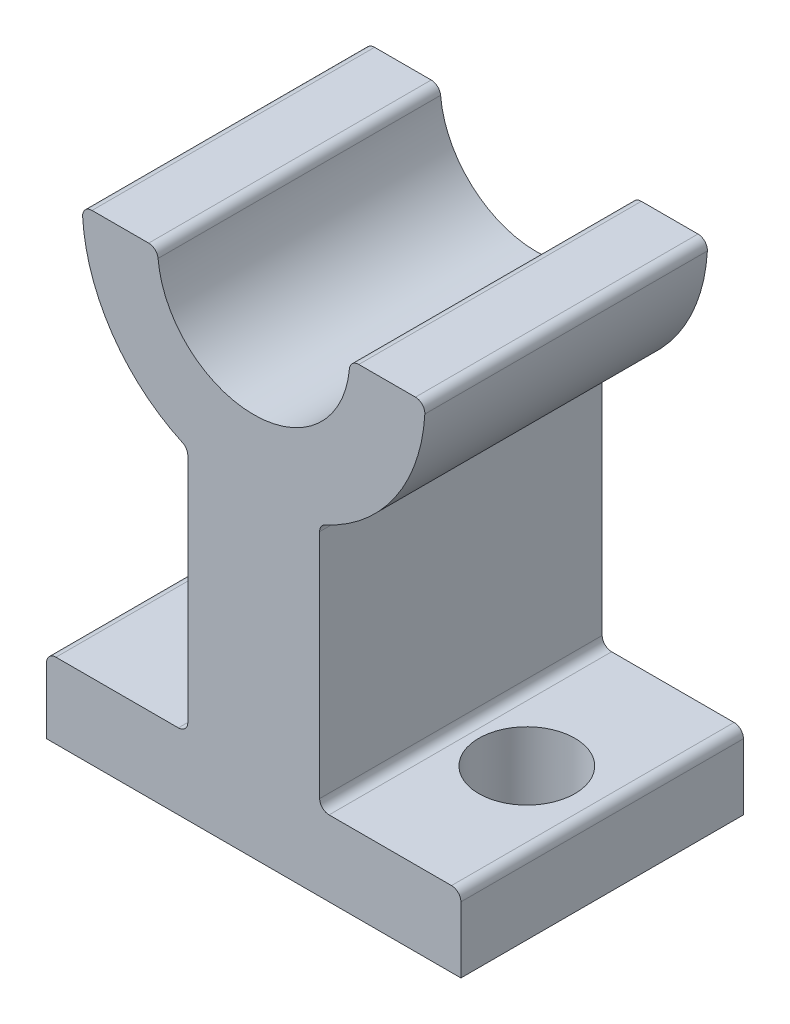
ISO-10303-21;
HEADER;
FILE_DESCRIPTION(('STEP AP214'),'2;1');
FILE_NAME('part.step','',(''),(''),'','','');
FILE_SCHEMA(('AUTOMOTIVE_DESIGN { 1 0 10303 214 1 1 1 1 }'));
ENDSEC;
DATA;
#1=APPLICATION_CONTEXT('core data for automotive mechanical design processes');
#2=APPLICATION_PROTOCOL_DEFINITION('international standard','automotive_design',2000,#1);
#3=PRODUCT_CONTEXT('',#1,'mechanical');
#4=PRODUCT('Part','Part','',(#3));
#5=PRODUCT_RELATED_PRODUCT_CATEGORY('part','',(#4));
#6=PRODUCT_DEFINITION_FORMATION('','',#4);
#7=PRODUCT_DEFINITION_CONTEXT('part definition',#1,'design');
#8=PRODUCT_DEFINITION('design','',#6,#7);
#9=PRODUCT_DEFINITION_SHAPE('','',#8);
#10=(LENGTH_UNIT() NAMED_UNIT(*) SI_UNIT(.MILLI.,.METRE.));
#11=(NAMED_UNIT(*) PLANE_ANGLE_UNIT() SI_UNIT($,.RADIAN.));
#12=(NAMED_UNIT(*) SI_UNIT($,.STERADIAN.) SOLID_ANGLE_UNIT());
#13=UNCERTAINTY_MEASURE_WITH_UNIT(LENGTH_MEASURE(1.E-05),#10,'distance_accuracy_value','');
#14=(GEOMETRIC_REPRESENTATION_CONTEXT(3) GLOBAL_UNCERTAINTY_ASSIGNED_CONTEXT((#13)) GLOBAL_UNIT_ASSIGNED_CONTEXT((#10,
#11,#12)) REPRESENTATION_CONTEXT('',''));
#15=CARTESIAN_POINT('',(0.,0.,0.));
#16=DIRECTION('',(0.,0.,1.));
#17=DIRECTION('',(1.,0.,0.));
#18=AXIS2_PLACEMENT_3D('',#15,#16,#17);
#19=CARTESIAN_POINT('',(11.,2.,15.));
#20=DIRECTION('',(-1.,0.,0.));
#21=DIRECTION('',(0.,0.,1.));
#22=AXIS2_PLACEMENT_3D('',#19,#20,#21);
#23=PLANE('',#22);
#24=DIRECTION('',(0.,1.,0.));
#25=VECTOR('',#24,1.);
#26=CARTESIAN_POINT('',(11.,2.,0.));
#27=LINE('',#26,#25);
#28=CARTESIAN_POINT('',(11.,-2.,0.));
#29=VERTEX_POINT('',#28);
#30=CARTESIAN_POINT('',(11.,1.5,0.));
#31=VERTEX_POINT('',#30);
#32=EDGE_CURVE('E225',#29,#31,#27,.T.);
#33=ORIENTED_EDGE('',*,*,#32,.T.);
#34=DIRECTION('',(0.,0.,-1.));
#35=VECTOR('',#34,1.);
#36=CARTESIAN_POINT('',(11.,1.5,15.));
#37=LINE('',#36,#35);
#38=CARTESIAN_POINT('',(11.,1.5,15.));
#39=VERTEX_POINT('',#38);
#40=EDGE_CURVE('E384',#31,#39,#37,.F.);
#41=ORIENTED_EDGE('',*,*,#40,.T.);
#42=DIRECTION('',(0.,1.,0.));
#43=VECTOR('',#42,1.);
#44=CARTESIAN_POINT('',(11.,2.,15.));
#45=LINE('',#44,#43);
#46=CARTESIAN_POINT('',(11.,-2.,15.));
#47=VERTEX_POINT('',#46);
#48=EDGE_CURVE('E267',#47,#39,#45,.T.);
#49=ORIENTED_EDGE('',*,*,#48,.F.);
#50=DIRECTION('',(0.,0.,-1.));
#51=VECTOR('',#50,1.);
#52=CARTESIAN_POINT('',(11.,-2.,15.));
#53=LINE('',#52,#51);
#54=EDGE_CURVE('E214',#47,#29,#53,.T.);
#55=ORIENTED_EDGE('',*,*,#54,.T.);
#56=EDGE_LOOP('',(#33,#41,#49,#55));
#57=FACE_BOUND('',#56,.T.);
#58=ADVANCED_FACE('F43',(#57),#23,.F.);
#59=CARTESIAN_POINT('',(3.5,2.,15.));
#60=DIRECTION('',(0.,-1.,0.));
#61=DIRECTION('',(1.,0.,0.));
#62=AXIS2_PLACEMENT_3D('',#59,#60,#61);
#63=PLANE('',#62);
#64=CARTESIAN_POINT('',(7.,2.,7.5));
#65=DIRECTION('',(0.,-1.,0.));
#66=DIRECTION('',(1.,0.,0.));
#67=AXIS2_PLACEMENT_3D('',#64,#65,#66);
#68=CIRCLE('',#67,2.55);
#69=CARTESIAN_POINT('',(9.55,2.,7.5));
#70=VERTEX_POINT('',#69);
#71=EDGE_CURVE('E451',#70,#70,#68,.T.);
#72=ORIENTED_EDGE('',*,*,#71,.T.);
#73=EDGE_LOOP('',(#72));
#74=FACE_BOUND('',#73,.T.);
#75=DIRECTION('',(-1.,0.,0.));
#76=VECTOR('',#75,1.);
#77=CARTESIAN_POINT('',(3.5,2.,15.));
#78=LINE('',#77,#76);
#79=CARTESIAN_POINT('',(10.5,2.,15.));
#80=VERTEX_POINT('',#79);
#81=CARTESIAN_POINT('',(4.,2.,15.));
#82=VERTEX_POINT('',#81);
#83=EDGE_CURVE('E443',#80,#82,#78,.T.);
#84=ORIENTED_EDGE('',*,*,#83,.F.);
#85=DIRECTION('',(0.,0.,-1.));
#86=VECTOR('',#85,1.);
#87=CARTESIAN_POINT('',(10.5,2.,15.));
#88=LINE('',#87,#86);
#89=CARTESIAN_POINT('',(10.5,2.,0.));
#90=VERTEX_POINT('',#89);
#91=EDGE_CURVE('E380',#80,#90,#88,.T.);
#92=ORIENTED_EDGE('',*,*,#91,.T.);
#93=DIRECTION('',(-1.,0.,0.));
#94=VECTOR('',#93,1.);
#95=CARTESIAN_POINT('',(3.5,2.,0.));
#96=LINE('',#95,#94);
#97=CARTESIAN_POINT('',(4.,2.,0.));
#98=VERTEX_POINT('',#97);
#99=EDGE_CURVE('E229',#90,#98,#96,.T.);
#100=ORIENTED_EDGE('',*,*,#99,.T.);
#101=DIRECTION('',(0.,0.,-1.));
#102=VECTOR('',#101,1.);
#103=CARTESIAN_POINT('',(4.,2.,15.));
#104=LINE('',#103,#102);
#105=EDGE_CURVE('E275',#98,#82,#104,.F.);
#106=ORIENTED_EDGE('',*,*,#105,.T.);
#107=EDGE_LOOP('',(#84,#92,#100,#106));
#108=FACE_BOUND('',#107,.T.);
#109=ADVANCED_FACE('F478',(#74,#108),#63,.F.);
#110=CARTESIAN_POINT('',(3.5,2.,15.));
#111=DIRECTION('',(-1.,0.,0.));
#112=DIRECTION('',(0.,-1.,0.));
#113=AXIS2_PLACEMENT_3D('',#110,#111,#112);
#114=PLANE('',#113);
#115=DIRECTION('',(0.,1.,0.));
#116=VECTOR('',#115,1.);
#117=CARTESIAN_POINT('',(3.5,2.,15.));
#118=LINE('',#117,#116);
#119=CARTESIAN_POINT('',(3.5,2.5,15.));
#120=VERTEX_POINT('',#119);
#121=CARTESIAN_POINT('',(3.5,14.7730303082914,15.));
#122=VERTEX_POINT('',#121);
#123=EDGE_CURVE('E439',#120,#122,#118,.T.);
#124=ORIENTED_EDGE('',*,*,#123,.F.);
#125=DIRECTION('',(0.,0.,-1.));
#126=VECTOR('',#125,1.);
#127=CARTESIAN_POINT('',(3.5,2.5,0.));
#128=LINE('',#127,#126);
#129=CARTESIAN_POINT('',(3.5,2.5,0.));
#130=VERTEX_POINT('',#129);
#131=EDGE_CURVE('E271',#120,#130,#128,.T.);
#132=ORIENTED_EDGE('',*,*,#131,.T.);
#133=DIRECTION('',(0.,1.,0.));
#134=VECTOR('',#133,1.);
#135=CARTESIAN_POINT('',(3.5,2.,0.));
#136=LINE('',#135,#134);
#137=CARTESIAN_POINT('',(3.5,14.7730303082914,0.));
#138=VERTEX_POINT('',#137);
#139=EDGE_CURVE('E233',#130,#138,#136,.T.);
#140=ORIENTED_EDGE('',*,*,#139,.T.);
#141=DIRECTION('',(0.,0.,1.));
#142=VECTOR('',#141,1.);
#143=CARTESIAN_POINT('',(3.5,14.7730303082914,15.));
#144=LINE('',#143,#142);
#145=EDGE_CURVE('E213',#138,#122,#144,.T.);
#146=ORIENTED_EDGE('',*,*,#145,.T.);
#147=EDGE_LOOP('',(#124,#132,#140,#146));
#148=FACE_BOUND('',#147,.T.);
#149=ADVANCED_FACE('F481',(#148),#114,.F.);
#150=CARTESIAN_POINT('',(0.,23.5,15.));
#151=DIRECTION('',(0.,0.,-1.));
#152=DIRECTION('',(-1.,0.,0.));
#153=AXIS2_PLACEMENT_3D('',#150,#151,#152);
#154=CYLINDRICAL_SURFACE('',#153,9.1);
#155=CARTESIAN_POINT('',(0.,23.5,0.));
#156=DIRECTION('',(0.,0.,1.));
#157=DIRECTION('',(1.,0.,0.));
#158=AXIS2_PLACEMENT_3D('',#155,#156,#157);
#159=CIRCLE('',#158,9.1);
#160=CARTESIAN_POINT('',(3.79166666666667,15.2275599797346,0.));
#161=VERTEX_POINT('',#160);
#162=CARTESIAN_POINT('',(9.08460704605207,22.9709302325581,0.));
#163=VERTEX_POINT('',#162);
#164=EDGE_CURVE('E237',#161,#163,#159,.T.);
#165=ORIENTED_EDGE('',*,*,#164,.T.);
#166=DIRECTION('',(0.,0.,-1.));
#167=VECTOR('',#166,1.);
#168=CARTESIAN_POINT('',(9.08460704605208,22.9709302325581,15.));
#169=LINE('',#168,#167);
#170=CARTESIAN_POINT('',(9.08460704605207,22.9709302325581,15.));
#171=VERTEX_POINT('',#170);
#172=EDGE_CURVE('E11',#163,#171,#169,.F.);
#173=ORIENTED_EDGE('',*,*,#172,.T.);
#174=CARTESIAN_POINT('',(0.,23.5,15.));
#175=DIRECTION('',(0.,0.,1.));
#176=DIRECTION('',(1.,0.,0.));
#177=AXIS2_PLACEMENT_3D('',#174,#175,#176);
#178=CIRCLE('',#177,9.1);
#179=CARTESIAN_POINT('',(3.79166666666667,15.2275599797346,15.));
#180=VERTEX_POINT('',#179);
#181=EDGE_CURVE('E435',#180,#171,#178,.T.);
#182=ORIENTED_EDGE('',*,*,#181,.F.);
#183=DIRECTION('',(0.,0.,-1.));
#184=VECTOR('',#183,1.);
#185=CARTESIAN_POINT('',(3.79166666666667,15.2275599797346,15.));
#186=LINE('',#185,#184);
#187=EDGE_CURVE('E294',#180,#161,#186,.T.);
#188=ORIENTED_EDGE('',*,*,#187,.T.);
#189=EDGE_LOOP('',(#165,#173,#182,#188));
#190=FACE_BOUND('',#189,.T.);
#191=ADVANCED_FACE('F555',(#190),#154,.T.);
#192=CARTESIAN_POINT('',(5.1,23.5,15.));
#193=DIRECTION('',(0.,-1.,0.));
#194=DIRECTION('',(0.,0.,-1.));
#195=AXIS2_PLACEMENT_3D('',#192,#193,#194);
#196=PLANE('',#195);
#197=DIRECTION('',(-1.,0.,0.));
#198=VECTOR('',#197,1.);
#199=CARTESIAN_POINT('',(5.1,23.5,0.));
#200=LINE('',#199,#198);
#201=CARTESIAN_POINT('',(8.58545281275251,23.5,0.));
#202=VERTEX_POINT('',#201);
#203=CARTESIAN_POINT('',(5.57763390695374,23.5,0.));
#204=VERTEX_POINT('',#203);
#205=EDGE_CURVE('E241',#202,#204,#200,.T.);
#206=ORIENTED_EDGE('',*,*,#205,.T.);
#207=DIRECTION('',(0.,0.,-1.));
#208=VECTOR('',#207,1.);
#209=CARTESIAN_POINT('',(5.57763390695374,23.5,15.));
#210=LINE('',#209,#208);
#211=CARTESIAN_POINT('',(5.57763390695374,23.5,15.));
#212=VERTEX_POINT('',#211);
#213=EDGE_CURVE('E353',#204,#212,#210,.F.);
#214=ORIENTED_EDGE('',*,*,#213,.T.);
#215=DIRECTION('',(-1.,0.,0.));
#216=VECTOR('',#215,1.);
#217=CARTESIAN_POINT('',(5.1,23.5,15.));
#218=LINE('',#217,#216);
#219=CARTESIAN_POINT('',(8.58545281275251,23.5,15.));
#220=VERTEX_POINT('',#219);
#221=EDGE_CURVE('E432',#220,#212,#218,.T.);
#222=ORIENTED_EDGE('',*,*,#221,.F.);
#223=DIRECTION('',(0.,0.,-1.));
#224=VECTOR('',#223,1.);
#225=CARTESIAN_POINT('',(8.58545281275251,23.5,15.));
#226=LINE('',#225,#224);
#227=EDGE_CURVE('E349',#220,#202,#226,.T.);
#228=ORIENTED_EDGE('',*,*,#227,.T.);
#229=EDGE_LOOP('',(#206,#214,#222,#228));
#230=FACE_BOUND('',#229,.T.);
#231=ADVANCED_FACE('F548',(#230),#196,.F.);
#232=CARTESIAN_POINT('',(0.,23.5,15.));
#233=DIRECTION('',(0.,0.,-1.));
#234=DIRECTION('',(-1.,0.,0.));
#235=AXIS2_PLACEMENT_3D('',#232,#233,#234);
#236=CYLINDRICAL_SURFACE('',#235,5.1);
#237=CARTESIAN_POINT('',(0.,23.5,15.));
#238=DIRECTION('',(0.,0.,-1.));
#239=DIRECTION('',(1.,0.,0.));
#240=AXIS2_PLACEMENT_3D('',#237,#238,#239);
#241=CIRCLE('',#240,5.1);
#242=CARTESIAN_POINT('',(5.07963087954715,23.0446428571429,15.));
#243=VERTEX_POINT('',#242);
#244=CARTESIAN_POINT('',(-5.07963087954715,23.0446428571429,15.));
#245=VERTEX_POINT('',#244);
#246=EDGE_CURVE('E428',#243,#245,#241,.T.);
#247=ORIENTED_EDGE('',*,*,#246,.F.);
#248=DIRECTION('',(0.,0.,-1.));
#249=VECTOR('',#248,1.);
#250=CARTESIAN_POINT('',(5.07963087954715,23.0446428571429,15.));
#251=LINE('',#250,#249);
#252=CARTESIAN_POINT('',(5.07963087954715,23.0446428571429,0.));
#253=VERTEX_POINT('',#252);
#254=EDGE_CURVE('E327',#243,#253,#251,.T.);
#255=ORIENTED_EDGE('',*,*,#254,.T.);
#256=CARTESIAN_POINT('',(0.,23.5,0.));
#257=DIRECTION('',(0.,0.,-1.));
#258=DIRECTION('',(1.,0.,0.));
#259=AXIS2_PLACEMENT_3D('',#256,#257,#258);
#260=CIRCLE('',#259,5.1);
#261=CARTESIAN_POINT('',(-5.07963087954715,23.0446428571429,0.));
#262=VERTEX_POINT('',#261);
#263=EDGE_CURVE('E245',#253,#262,#260,.T.);
#264=ORIENTED_EDGE('',*,*,#263,.T.);
#265=DIRECTION('',(0.,0.,-1.));
#266=VECTOR('',#265,1.);
#267=CARTESIAN_POINT('',(-5.07963087954715,23.0446428571429,15.));
#268=LINE('',#267,#266);
#269=EDGE_CURVE('E324',#262,#245,#268,.F.);
#270=ORIENTED_EDGE('',*,*,#269,.T.);
#271=EDGE_LOOP('',(#247,#255,#264,#270));
#272=FACE_BOUND('',#271,.T.);
#273=ADVANCED_FACE('F542',(#272),#236,.F.);
#274=CARTESIAN_POINT('',(-9.1,23.5,15.));
#275=DIRECTION('',(0.,-1.,0.));
#276=DIRECTION('',(0.,0.,-1.));
#277=AXIS2_PLACEMENT_3D('',#274,#275,#276);
#278=PLANE('',#277);
#279=DIRECTION('',(-1.,0.,0.));
#280=VECTOR('',#279,1.);
#281=CARTESIAN_POINT('',(-9.1,23.5,15.));
#282=LINE('',#281,#280);
#283=CARTESIAN_POINT('',(-5.57763390695374,23.5,15.));
#284=VERTEX_POINT('',#283);
#285=CARTESIAN_POINT('',(-8.58545281275251,23.5,15.));
#286=VERTEX_POINT('',#285);
#287=EDGE_CURVE('E422',#284,#286,#282,.T.);
#288=ORIENTED_EDGE('',*,*,#287,.F.);
#289=DIRECTION('',(0.,0.,-1.));
#290=VECTOR('',#289,1.);
#291=CARTESIAN_POINT('',(-5.57763390695374,23.5,15.));
#292=LINE('',#291,#290);
#293=CARTESIAN_POINT('',(-5.57763390695374,23.5,0.));
#294=VERTEX_POINT('',#293);
#295=EDGE_CURVE('E376',#284,#294,#292,.T.);
#296=ORIENTED_EDGE('',*,*,#295,.T.);
#297=DIRECTION('',(-1.,0.,0.));
#298=VECTOR('',#297,1.);
#299=CARTESIAN_POINT('',(-9.1,23.5,0.));
#300=LINE('',#299,#298);
#301=CARTESIAN_POINT('',(-8.58545281275251,23.5,0.));
#302=VERTEX_POINT('',#301);
#303=EDGE_CURVE('E249',#294,#302,#300,.T.);
#304=ORIENTED_EDGE('',*,*,#303,.T.);
#305=DIRECTION('',(0.,0.,-1.));
#306=VECTOR('',#305,1.);
#307=CARTESIAN_POINT('',(-8.58545281275251,23.5,15.));
#308=LINE('',#307,#306);
#309=EDGE_CURVE('E373',#302,#286,#308,.F.);
#310=ORIENTED_EDGE('',*,*,#309,.T.);
#311=EDGE_LOOP('',(#288,#296,#304,#310));
#312=FACE_BOUND('',#311,.T.);
#313=ADVANCED_FACE('F538',(#312),#278,.F.);
#314=CARTESIAN_POINT('',(0.,23.5,15.));
#315=DIRECTION('',(0.,0.,-1.));
#316=DIRECTION('',(-1.,0.,0.));
#317=AXIS2_PLACEMENT_3D('',#314,#315,#316);
#318=CYLINDRICAL_SURFACE('',#317,9.1);
#319=CARTESIAN_POINT('',(0.,23.5,15.));
#320=DIRECTION('',(0.,0.,1.));
#321=DIRECTION('',(1.,0.,0.));
#322=AXIS2_PLACEMENT_3D('',#319,#320,#321);
#323=CIRCLE('',#322,9.1);
#324=CARTESIAN_POINT('',(-9.08460704605207,22.9709302325581,15.));
#325=VERTEX_POINT('',#324);
#326=CARTESIAN_POINT('',(-3.79166666666667,15.2275599797346,15.));
#327=VERTEX_POINT('',#326);
#328=EDGE_CURVE('E398',#325,#327,#323,.T.);
#329=ORIENTED_EDGE('',*,*,#328,.F.);
#330=DIRECTION('',(0.,0.,-1.));
#331=VECTOR('',#330,1.);
#332=CARTESIAN_POINT('',(-9.08460704605208,22.9709302325581,15.));
#333=LINE('',#332,#331);
#334=CARTESIAN_POINT('',(-9.08460704605207,22.9709302325581,0.));
#335=VERTEX_POINT('',#334);
#336=EDGE_CURVE('E52',#325,#335,#333,.T.);
#337=ORIENTED_EDGE('',*,*,#336,.T.);
#338=CARTESIAN_POINT('',(0.,23.5,0.));
#339=DIRECTION('',(0.,0.,1.));
#340=DIRECTION('',(1.,0.,0.));
#341=AXIS2_PLACEMENT_3D('',#338,#339,#340);
#342=CIRCLE('',#341,9.1);
#343=CARTESIAN_POINT('',(-3.79166666666667,15.2275599797346,0.));
#344=VERTEX_POINT('',#343);
#345=EDGE_CURVE('E253',#335,#344,#342,.T.);
#346=ORIENTED_EDGE('',*,*,#345,.T.);
#347=DIRECTION('',(0.,0.,-1.));
#348=VECTOR('',#347,1.);
#349=CARTESIAN_POINT('',(-3.79166666666667,15.2275599797346,15.));
#350=LINE('',#349,#348);
#351=EDGE_CURVE('E290',#344,#327,#350,.F.);
#352=ORIENTED_EDGE('',*,*,#351,.T.);
#353=EDGE_LOOP('',(#329,#337,#346,#352));
#354=FACE_BOUND('',#353,.T.);
#355=ADVANCED_FACE('F397',(#354),#318,.T.);
#356=CARTESIAN_POINT('',(-3.5,2.,15.));
#357=DIRECTION('',(1.,0.,0.));
#358=DIRECTION('',(0.,1.,0.));
#359=AXIS2_PLACEMENT_3D('',#356,#357,#358);
#360=PLANE('',#359);
#361=DIRECTION('',(0.,-1.,0.));
#362=VECTOR('',#361,1.);
#363=CARTESIAN_POINT('',(-3.5,2.,0.));
#364=LINE('',#363,#362);
#365=CARTESIAN_POINT('',(-3.5,14.7730303082914,0.));
#366=VERTEX_POINT('',#365);
#367=CARTESIAN_POINT('',(-3.5,2.5,0.));
#368=VERTEX_POINT('',#367);
#369=EDGE_CURVE('E256',#366,#368,#364,.T.);
#370=ORIENTED_EDGE('',*,*,#369,.T.);
#371=DIRECTION('',(0.,0.,-1.));
#372=VECTOR('',#371,1.);
#373=CARTESIAN_POINT('',(-3.5,2.5,15.));
#374=LINE('',#373,#372);
#375=CARTESIAN_POINT('',(-3.5,2.5,15.));
#376=VERTEX_POINT('',#375);
#377=EDGE_CURVE('E287',#368,#376,#374,.F.);
#378=ORIENTED_EDGE('',*,*,#377,.T.);
#379=DIRECTION('',(0.,-1.,0.));
#380=VECTOR('',#379,1.);
#381=CARTESIAN_POINT('',(-3.5,2.,15.));
#382=LINE('',#381,#380);
#383=CARTESIAN_POINT('',(-3.5,14.7730303082914,15.));
#384=VERTEX_POINT('',#383);
#385=EDGE_CURVE('E413',#384,#376,#382,.T.);
#386=ORIENTED_EDGE('',*,*,#385,.F.);
#387=DIRECTION('',(0.,0.,1.));
#388=VECTOR('',#387,1.);
#389=CARTESIAN_POINT('',(-3.5,14.7730303082914,0.));
#390=LINE('',#389,#388);
#391=EDGE_CURVE('E283',#384,#366,#390,.F.);
#392=ORIENTED_EDGE('',*,*,#391,.T.);
#393=EDGE_LOOP('',(#370,#378,#386,#392));
#394=FACE_BOUND('',#393,.T.);
#395=ADVANCED_FACE('F416',(#394),#360,.F.);
#396=CARTESIAN_POINT('',(-11.,2.,15.));
#397=DIRECTION('',(0.,-1.,0.));
#398=DIRECTION('',(0.,0.,-1.));
#399=AXIS2_PLACEMENT_3D('',#396,#397,#398);
#400=PLANE('',#399);
#401=CARTESIAN_POINT('',(-7.,2.,7.5));
#402=DIRECTION('',(0.,-1.,0.));
#403=DIRECTION('',(0.,0.,-1.));
#404=AXIS2_PLACEMENT_3D('',#401,#402,#403);
#405=CIRCLE('',#404,2.55);
#406=CARTESIAN_POINT('',(-7.,2.,4.95));
#407=VERTEX_POINT('',#406);
#408=EDGE_CURVE('E230',#407,#407,#405,.T.);
#409=ORIENTED_EDGE('',*,*,#408,.T.);
#410=EDGE_LOOP('',(#409));
#411=FACE_BOUND('',#410,.T.);
#412=DIRECTION('',(-1.,0.,0.));
#413=VECTOR('',#412,1.);
#414=CARTESIAN_POINT('',(-11.,2.,0.));
#415=LINE('',#414,#413);
#416=CARTESIAN_POINT('',(-4.,2.,0.));
#417=VERTEX_POINT('',#416);
#418=CARTESIAN_POINT('',(-10.5,2.,0.));
#419=VERTEX_POINT('',#418);
#420=EDGE_CURVE('E260',#417,#419,#415,.T.);
#421=ORIENTED_EDGE('',*,*,#420,.T.);
#422=DIRECTION('',(0.,0.,-1.));
#423=VECTOR('',#422,1.);
#424=CARTESIAN_POINT('',(-10.5,2.,15.));
#425=LINE('',#424,#423);
#426=CARTESIAN_POINT('',(-10.5,2.,15.));
#427=VERTEX_POINT('',#426);
#428=EDGE_CURVE('E67',#419,#427,#425,.F.);
#429=ORIENTED_EDGE('',*,*,#428,.T.);
#430=DIRECTION('',(-1.,0.,0.));
#431=VECTOR('',#430,1.);
#432=CARTESIAN_POINT('',(-11.,2.,15.));
#433=LINE('',#432,#431);
#434=CARTESIAN_POINT('',(-4.,2.,15.));
#435=VERTEX_POINT('',#434);
#436=EDGE_CURVE('E203',#435,#427,#433,.T.);
#437=ORIENTED_EDGE('',*,*,#436,.F.);
#438=DIRECTION('',(0.,0.,-1.));
#439=VECTOR('',#438,1.);
#440=CARTESIAN_POINT('',(-4.,2.,0.));
#441=LINE('',#440,#439);
#442=EDGE_CURVE('E279',#435,#417,#441,.T.);
#443=ORIENTED_EDGE('',*,*,#442,.T.);
#444=EDGE_LOOP('',(#421,#429,#437,#443));
#445=FACE_BOUND('',#444,.T.);
#446=ADVANCED_FACE('F580',(#411,#445),#400,.F.);
#447=CARTESIAN_POINT('',(-11.,2.,15.));
#448=DIRECTION('',(1.,0.,0.));
#449=DIRECTION('',(0.,0.,-1.));
#450=AXIS2_PLACEMENT_3D('',#447,#448,#449);
#451=PLANE('',#450);
#452=DIRECTION('',(0.,-1.,0.));
#453=VECTOR('',#452,1.);
#454=CARTESIAN_POINT('',(-11.,2.,15.));
#455=LINE('',#454,#453);
#456=CARTESIAN_POINT('',(-11.,1.5,15.));
#457=VERTEX_POINT('',#456);
#458=CARTESIAN_POINT('',(-11.,-2.,15.));
#459=VERTEX_POINT('',#458);
#460=EDGE_CURVE('E191',#457,#459,#455,.T.);
#461=ORIENTED_EDGE('',*,*,#460,.F.);
#462=DIRECTION('',(0.,0.,-1.));
#463=VECTOR('',#462,1.);
#464=CARTESIAN_POINT('',(-11.,1.5,15.));
#465=LINE('',#464,#463);
#466=CARTESIAN_POINT('',(-11.,1.5,0.));
#467=VERTEX_POINT('',#466);
#468=EDGE_CURVE('E387',#457,#467,#465,.T.);
#469=ORIENTED_EDGE('',*,*,#468,.T.);
#470=DIRECTION('',(0.,-1.,0.));
#471=VECTOR('',#470,1.);
#472=CARTESIAN_POINT('',(-11.,2.,0.));
#473=LINE('',#472,#471);
#474=CARTESIAN_POINT('',(-11.,-2.,0.));
#475=VERTEX_POINT('',#474);
#476=EDGE_CURVE('E209',#467,#475,#473,.T.);
#477=ORIENTED_EDGE('',*,*,#476,.T.);
#478=DIRECTION('',(0.,0.,-1.));
#479=VECTOR('',#478,1.);
#480=CARTESIAN_POINT('',(-11.,-2.,15.));
#481=LINE('',#480,#479);
#482=EDGE_CURVE('E206',#459,#475,#481,.T.);
#483=ORIENTED_EDGE('',*,*,#482,.F.);
#484=EDGE_LOOP('',(#461,#469,#477,#483));
#485=FACE_BOUND('',#484,.T.);
#486=ADVANCED_FACE('F207',(#485),#451,.F.);
#487=CARTESIAN_POINT('',(-11.,-2.,15.));
#488=DIRECTION('',(0.,1.,0.));
#489=DIRECTION('',(0.,0.,1.));
#490=AXIS2_PLACEMENT_3D('',#487,#488,#489);
#491=PLANE('',#490);
#492=CARTESIAN_POINT('',(-7.,-2.,7.5));
#493=DIRECTION('',(0.,-1.,0.));
#494=DIRECTION('',(0.,0.,-1.));
#495=AXIS2_PLACEMENT_3D('',#492,#493,#494);
#496=CIRCLE('',#495,2.55);
#497=CARTESIAN_POINT('',(-7.,-2.,4.95));
#498=VERTEX_POINT('',#497);
#499=EDGE_CURVE('E455',#498,#498,#496,.T.);
#500=ORIENTED_EDGE('',*,*,#499,.F.);
#501=EDGE_LOOP('',(#500));
#502=FACE_BOUND('',#501,.T.);
#503=CARTESIAN_POINT('',(7.,-2.,7.5));
#504=DIRECTION('',(0.,-1.,0.));
#505=DIRECTION('',(0.,0.,1.));
#506=AXIS2_PLACEMENT_3D('',#503,#504,#505);
#507=CIRCLE('',#506,2.55);
#508=CARTESIAN_POINT('',(7.,-2.,10.05));
#509=VERTEX_POINT('',#508);
#510=EDGE_CURVE('E456',#509,#509,#507,.T.);
#511=ORIENTED_EDGE('',*,*,#510,.F.);
#512=EDGE_LOOP('',(#511));
#513=FACE_BOUND('',#512,.T.);
#514=DIRECTION('',(1.,0.,0.));
#515=VECTOR('',#514,1.);
#516=CARTESIAN_POINT('',(-11.,-2.,0.));
#517=LINE('',#516,#515);
#518=EDGE_CURVE('E265',#475,#29,#517,.T.);
#519=ORIENTED_EDGE('',*,*,#518,.T.);
#520=ORIENTED_EDGE('',*,*,#54,.F.);
#521=DIRECTION('',(1.,0.,0.));
#522=VECTOR('',#521,1.);
#523=CARTESIAN_POINT('',(-11.,-2.,15.));
#524=LINE('',#523,#522);
#525=EDGE_CURVE('E197',#459,#47,#524,.T.);
#526=ORIENTED_EDGE('',*,*,#525,.F.);
#527=ORIENTED_EDGE('',*,*,#482,.T.);
#528=EDGE_LOOP('',(#519,#520,#526,#527));
#529=FACE_BOUND('',#528,.T.);
#530=ADVANCED_FACE('F216',(#502,#513,#529),#491,.F.);
#531=CARTESIAN_POINT('',(0.,23.5,15.));
#532=DIRECTION('',(0.,0.,1.));
#533=DIRECTION('',(1.,0.,0.));
#534=AXIS2_PLACEMENT_3D('',#531,#532,#533);
#535=PLANE('',#534);
#536=ORIENTED_EDGE('',*,*,#221,.T.);
#537=CARTESIAN_POINT('',(5.57763390695374,23.,15.));
#538=DIRECTION('',(0.,0.,1.));
#539=DIRECTION('',(1.,0.,0.));
#540=AXIS2_PLACEMENT_3D('',#537,#538,#539);
#541=CIRCLE('',#540,0.5);
#542=EDGE_CURVE('E370',#212,#243,#541,.T.);
#543=ORIENTED_EDGE('',*,*,#542,.T.);
#544=ORIENTED_EDGE('',*,*,#246,.T.);
#545=CARTESIAN_POINT('',(-5.57763390695374,23.,15.));
#546=DIRECTION('',(0.,0.,1.));
#547=DIRECTION('',(1.,0.,0.));
#548=AXIS2_PLACEMENT_3D('',#545,#546,#547);
#549=CIRCLE('',#548,0.5);
#550=EDGE_CURVE('E367',#245,#284,#549,.T.);
#551=ORIENTED_EDGE('',*,*,#550,.T.);
#552=ORIENTED_EDGE('',*,*,#287,.T.);
#553=CARTESIAN_POINT('',(-8.58545281275251,23.,15.));
#554=DIRECTION('',(0.,0.,1.));
#555=DIRECTION('',(1.,0.,0.));
#556=AXIS2_PLACEMENT_3D('',#553,#554,#555);
#557=CIRCLE('',#556,0.5);
#558=EDGE_CURVE('E359',#286,#325,#557,.T.);
#559=ORIENTED_EDGE('',*,*,#558,.T.);
#560=ORIENTED_EDGE('',*,*,#328,.T.);
#561=CARTESIAN_POINT('',(-4.,14.7730303082914,15.));
#562=DIRECTION('',(0.,0.,1.));
#563=DIRECTION('',(1.,0.,0.));
#564=AXIS2_PLACEMENT_3D('',#561,#562,#563);
#565=CIRCLE('',#564,0.5);
#566=EDGE_CURVE('E315',#327,#384,#565,.F.);
#567=ORIENTED_EDGE('',*,*,#566,.T.);
#568=ORIENTED_EDGE('',*,*,#385,.T.);
#569=CARTESIAN_POINT('',(-4.,2.5,15.));
#570=DIRECTION('',(0.,0.,1.));
#571=DIRECTION('',(1.,0.,0.));
#572=AXIS2_PLACEMENT_3D('',#569,#570,#571);
#573=CIRCLE('',#572,0.5);
#574=EDGE_CURVE('E308',#376,#435,#573,.F.);
#575=ORIENTED_EDGE('',*,*,#574,.T.);
#576=ORIENTED_EDGE('',*,*,#436,.T.);
#577=CARTESIAN_POINT('',(-10.5,1.5,15.));
#578=DIRECTION('',(0.,0.,1.));
#579=DIRECTION('',(1.,0.,0.));
#580=AXIS2_PLACEMENT_3D('',#577,#578,#579);
#581=CIRCLE('',#580,0.5);
#582=EDGE_CURVE('E59',#427,#457,#581,.T.);
#583=ORIENTED_EDGE('',*,*,#582,.T.);
#584=ORIENTED_EDGE('',*,*,#460,.T.);
#585=ORIENTED_EDGE('',*,*,#525,.T.);
#586=ORIENTED_EDGE('',*,*,#48,.T.);
#587=CARTESIAN_POINT('',(10.5,1.5,15.));
#588=DIRECTION('',(0.,0.,1.));
#589=DIRECTION('',(1.,0.,0.));
#590=AXIS2_PLACEMENT_3D('',#587,#588,#589);
#591=CIRCLE('',#590,0.5);
#592=EDGE_CURVE('E364',#39,#80,#591,.T.);
#593=ORIENTED_EDGE('',*,*,#592,.T.);
#594=ORIENTED_EDGE('',*,*,#83,.T.);
#595=CARTESIAN_POINT('',(4.,2.5,15.));
#596=DIRECTION('',(0.,0.,1.));
#597=DIRECTION('',(1.,0.,0.));
#598=AXIS2_PLACEMENT_3D('',#595,#596,#597);
#599=CIRCLE('',#598,0.5);
#600=EDGE_CURVE('E302',#82,#120,#599,.F.);
#601=ORIENTED_EDGE('',*,*,#600,.T.);
#602=ORIENTED_EDGE('',*,*,#123,.T.);
#603=CARTESIAN_POINT('',(4.,14.7730303082914,15.));
#604=DIRECTION('',(0.,0.,1.));
#605=DIRECTION('',(1.,0.,0.));
#606=AXIS2_PLACEMENT_3D('',#603,#604,#605);
#607=CIRCLE('',#606,0.5);
#608=EDGE_CURVE('E321',#122,#180,#607,.F.);
#609=ORIENTED_EDGE('',*,*,#608,.T.);
#610=ORIENTED_EDGE('',*,*,#181,.T.);
#611=CARTESIAN_POINT('',(8.58545281275251,23.,15.));
#612=DIRECTION('',(0.,0.,1.));
#613=DIRECTION('',(1.,0.,0.));
#614=AXIS2_PLACEMENT_3D('',#611,#612,#613);
#615=CIRCLE('',#614,0.5);
#616=EDGE_CURVE('E356',#171,#220,#615,.T.);
#617=ORIENTED_EDGE('',*,*,#616,.T.);
#618=EDGE_LOOP('',(#536,#543,#544,#551,#552,#559,#560,#567,#568,#575,#576,#583,#584,#585,#586,
#593,#594,#601,#602,#609,#610,#617));
#619=FACE_BOUND('',#618,.T.);
#620=ADVANCED_FACE('F194',(#619),#535,.T.);
#621=CARTESIAN_POINT('',(0.,23.5,0.));
#622=DIRECTION('',(0.,0.,1.));
#623=DIRECTION('',(1.,0.,0.));
#624=AXIS2_PLACEMENT_3D('',#621,#622,#623);
#625=PLANE('',#624);
#626=ORIENTED_EDGE('',*,*,#263,.F.);
#627=CARTESIAN_POINT('',(5.57763390695374,23.,0.));
#628=DIRECTION('',(0.,0.,1.));
#629=DIRECTION('',(1.,0.,0.));
#630=AXIS2_PLACEMENT_3D('',#627,#628,#629);
#631=CIRCLE('',#630,0.5);
#632=EDGE_CURVE('E346',#253,#204,#631,.F.);
#633=ORIENTED_EDGE('',*,*,#632,.T.);
#634=ORIENTED_EDGE('',*,*,#205,.F.);
#635=CARTESIAN_POINT('',(8.58545281275251,23.,0.));
#636=DIRECTION('',(0.,0.,1.));
#637=DIRECTION('',(1.,0.,0.));
#638=AXIS2_PLACEMENT_3D('',#635,#636,#637);
#639=CIRCLE('',#638,0.5);
#640=EDGE_CURVE('E331',#202,#163,#639,.F.);
#641=ORIENTED_EDGE('',*,*,#640,.T.);
#642=ORIENTED_EDGE('',*,*,#164,.F.);
#643=CARTESIAN_POINT('',(4.,14.7730303082914,0.));
#644=DIRECTION('',(0.,0.,1.));
#645=DIRECTION('',(1.,0.,0.));
#646=AXIS2_PLACEMENT_3D('',#643,#644,#645);
#647=CIRCLE('',#646,0.5);
#648=EDGE_CURVE('E318',#161,#138,#647,.T.);
#649=ORIENTED_EDGE('',*,*,#648,.T.);
#650=ORIENTED_EDGE('',*,*,#139,.F.);
#651=CARTESIAN_POINT('',(4.,2.5,0.));
#652=DIRECTION('',(0.,0.,1.));
#653=DIRECTION('',(1.,0.,0.));
#654=AXIS2_PLACEMENT_3D('',#651,#652,#653);
#655=CIRCLE('',#654,0.5);
#656=EDGE_CURVE('E298',#130,#98,#655,.T.);
#657=ORIENTED_EDGE('',*,*,#656,.T.);
#658=ORIENTED_EDGE('',*,*,#99,.F.);
#659=CARTESIAN_POINT('',(10.5,1.5,0.));
#660=DIRECTION('',(0.,0.,1.));
#661=DIRECTION('',(1.,0.,0.));
#662=AXIS2_PLACEMENT_3D('',#659,#660,#661);
#663=CIRCLE('',#662,0.5);
#664=EDGE_CURVE('E340',#90,#31,#663,.F.);
#665=ORIENTED_EDGE('',*,*,#664,.T.);
#666=ORIENTED_EDGE('',*,*,#32,.F.);
#667=ORIENTED_EDGE('',*,*,#518,.F.);
#668=ORIENTED_EDGE('',*,*,#476,.F.);
#669=CARTESIAN_POINT('',(-10.5,1.5,0.));
#670=DIRECTION('',(0.,0.,1.));
#671=DIRECTION('',(1.,0.,0.));
#672=AXIS2_PLACEMENT_3D('',#669,#670,#671);
#673=CIRCLE('',#672,0.5);
#674=EDGE_CURVE('E337',#467,#419,#673,.F.);
#675=ORIENTED_EDGE('',*,*,#674,.T.);
#676=ORIENTED_EDGE('',*,*,#420,.F.);
#677=CARTESIAN_POINT('',(-4.,2.5,0.));
#678=DIRECTION('',(0.,0.,1.));
#679=DIRECTION('',(1.,0.,0.));
#680=AXIS2_PLACEMENT_3D('',#677,#678,#679);
#681=CIRCLE('',#680,0.5);
#682=EDGE_CURVE('E305',#417,#368,#681,.T.);
#683=ORIENTED_EDGE('',*,*,#682,.T.);
#684=ORIENTED_EDGE('',*,*,#369,.F.);
#685=CARTESIAN_POINT('',(-4.,14.7730303082914,0.));
#686=DIRECTION('',(0.,0.,1.));
#687=DIRECTION('',(1.,0.,0.));
#688=AXIS2_PLACEMENT_3D('',#685,#686,#687);
#689=CIRCLE('',#688,0.5);
#690=EDGE_CURVE('E311',#366,#344,#689,.T.);
#691=ORIENTED_EDGE('',*,*,#690,.T.);
#692=ORIENTED_EDGE('',*,*,#345,.F.);
#693=CARTESIAN_POINT('',(-8.58545281275251,23.,0.));
#694=DIRECTION('',(0.,0.,1.));
#695=DIRECTION('',(1.,0.,0.));
#696=AXIS2_PLACEMENT_3D('',#693,#694,#695);
#697=CIRCLE('',#696,0.5);
#698=EDGE_CURVE('E334',#335,#302,#697,.F.);
#699=ORIENTED_EDGE('',*,*,#698,.T.);
#700=ORIENTED_EDGE('',*,*,#303,.F.);
#701=CARTESIAN_POINT('',(-5.57763390695374,23.,0.));
#702=DIRECTION('',(0.,0.,1.));
#703=DIRECTION('',(1.,0.,0.));
#704=AXIS2_PLACEMENT_3D('',#701,#702,#703);
#705=CIRCLE('',#704,0.5);
#706=EDGE_CURVE('E343',#294,#262,#705,.F.);
#707=ORIENTED_EDGE('',*,*,#706,.T.);
#708=EDGE_LOOP('',(#626,#633,#634,#641,#642,#649,#650,#657,#658,#665,#666,#667,#668,#675,#676,
#683,#684,#691,#692,#699,#700,#707));
#709=FACE_BOUND('',#708,.T.);
#710=ADVANCED_FACE('F403',(#709),#625,.F.);
#711=CARTESIAN_POINT('',(4.,2.5,15.));
#712=DIRECTION('',(0.,0.,1.));
#713=DIRECTION('',(1.,0.,0.));
#714=AXIS2_PLACEMENT_3D('',#711,#712,#713);
#715=CYLINDRICAL_SURFACE('',#714,0.5);
#716=ORIENTED_EDGE('',*,*,#600,.F.);
#717=ORIENTED_EDGE('',*,*,#105,.F.);
#718=ORIENTED_EDGE('',*,*,#656,.F.);
#719=ORIENTED_EDGE('',*,*,#131,.F.);
#720=EDGE_LOOP('',(#716,#717,#718,#719));
#721=FACE_BOUND('',#720,.T.);
#722=ADVANCED_FACE('F500',(#721),#715,.F.);
#723=CARTESIAN_POINT('',(-4.,2.5,15.));
#724=DIRECTION('',(0.,0.,1.));
#725=DIRECTION('',(1.,0.,0.));
#726=AXIS2_PLACEMENT_3D('',#723,#724,#725);
#727=CYLINDRICAL_SURFACE('',#726,0.5);
#728=ORIENTED_EDGE('',*,*,#574,.F.);
#729=ORIENTED_EDGE('',*,*,#377,.F.);
#730=ORIENTED_EDGE('',*,*,#682,.F.);
#731=ORIENTED_EDGE('',*,*,#442,.F.);
#732=EDGE_LOOP('',(#728,#729,#730,#731));
#733=FACE_BOUND('',#732,.T.);
#734=ADVANCED_FACE('F503',(#733),#727,.F.);
#735=CARTESIAN_POINT('',(-4.,14.7730303082914,15.));
#736=DIRECTION('',(0.,0.,-1.));
#737=DIRECTION('',(-1.,0.,0.));
#738=AXIS2_PLACEMENT_3D('',#735,#736,#737);
#739=CYLINDRICAL_SURFACE('',#738,0.5);
#740=ORIENTED_EDGE('',*,*,#566,.F.);
#741=ORIENTED_EDGE('',*,*,#351,.F.);
#742=ORIENTED_EDGE('',*,*,#690,.F.);
#743=ORIENTED_EDGE('',*,*,#391,.F.);
#744=EDGE_LOOP('',(#740,#741,#742,#743));
#745=FACE_BOUND('',#744,.T.);
#746=ADVANCED_FACE('F410',(#745),#739,.F.);
#747=CARTESIAN_POINT('',(4.,14.7730303082914,15.));
#748=DIRECTION('',(0.,0.,-1.));
#749=DIRECTION('',(-1.,0.,0.));
#750=AXIS2_PLACEMENT_3D('',#747,#748,#749);
#751=CYLINDRICAL_SURFACE('',#750,0.5);
#752=ORIENTED_EDGE('',*,*,#608,.F.);
#753=ORIENTED_EDGE('',*,*,#145,.F.);
#754=ORIENTED_EDGE('',*,*,#648,.F.);
#755=ORIENTED_EDGE('',*,*,#187,.F.);
#756=EDGE_LOOP('',(#752,#753,#754,#755));
#757=FACE_BOUND('',#756,.T.);
#758=ADVANCED_FACE('F510',(#757),#751,.F.);
#759=CARTESIAN_POINT('',(5.57763390695374,23.,15.));
#760=DIRECTION('',(0.,0.,-1.));
#761=DIRECTION('',(-1.,0.,0.));
#762=AXIS2_PLACEMENT_3D('',#759,#760,#761);
#763=CYLINDRICAL_SURFACE('',#762,0.5);
#764=ORIENTED_EDGE('',*,*,#542,.F.);
#765=ORIENTED_EDGE('',*,*,#213,.F.);
#766=ORIENTED_EDGE('',*,*,#632,.F.);
#767=ORIENTED_EDGE('',*,*,#254,.F.);
#768=EDGE_LOOP('',(#764,#765,#766,#767));
#769=FACE_BOUND('',#768,.T.);
#770=ADVANCED_FACE('F513',(#769),#763,.T.);
#771=CARTESIAN_POINT('',(-5.57763390695374,23.,15.));
#772=DIRECTION('',(0.,0.,-1.));
#773=DIRECTION('',(-1.,0.,0.));
#774=AXIS2_PLACEMENT_3D('',#771,#772,#773);
#775=CYLINDRICAL_SURFACE('',#774,0.5);
#776=ORIENTED_EDGE('',*,*,#550,.F.);
#777=ORIENTED_EDGE('',*,*,#269,.F.);
#778=ORIENTED_EDGE('',*,*,#706,.F.);
#779=ORIENTED_EDGE('',*,*,#295,.F.);
#780=EDGE_LOOP('',(#776,#777,#778,#779));
#781=FACE_BOUND('',#780,.T.);
#782=ADVANCED_FACE('F517',(#781),#775,.T.);
#783=CARTESIAN_POINT('',(10.5,1.5,15.));
#784=DIRECTION('',(0.,0.,-1.));
#785=DIRECTION('',(-1.,0.,0.));
#786=AXIS2_PLACEMENT_3D('',#783,#784,#785);
#787=CYLINDRICAL_SURFACE('',#786,0.5);
#788=ORIENTED_EDGE('',*,*,#592,.F.);
#789=ORIENTED_EDGE('',*,*,#40,.F.);
#790=ORIENTED_EDGE('',*,*,#664,.F.);
#791=ORIENTED_EDGE('',*,*,#91,.F.);
#792=EDGE_LOOP('',(#788,#789,#790,#791));
#793=FACE_BOUND('',#792,.T.);
#794=ADVANCED_FACE('F490',(#793),#787,.T.);
#795=CARTESIAN_POINT('',(-10.5,1.5,15.));
#796=DIRECTION('',(0.,0.,-1.));
#797=DIRECTION('',(-1.,0.,0.));
#798=AXIS2_PLACEMENT_3D('',#795,#796,#797);
#799=CYLINDRICAL_SURFACE('',#798,0.5);
#800=ORIENTED_EDGE('',*,*,#582,.F.);
#801=ORIENTED_EDGE('',*,*,#428,.F.);
#802=ORIENTED_EDGE('',*,*,#674,.F.);
#803=ORIENTED_EDGE('',*,*,#468,.F.);
#804=EDGE_LOOP('',(#800,#801,#802,#803));
#805=FACE_BOUND('',#804,.T.);
#806=ADVANCED_FACE('F524',(#805),#799,.T.);
#807=CARTESIAN_POINT('',(-8.58545281275251,23.,15.));
#808=DIRECTION('',(0.,0.,-1.));
#809=DIRECTION('',(-1.,0.,0.));
#810=AXIS2_PLACEMENT_3D('',#807,#808,#809);
#811=CYLINDRICAL_SURFACE('',#810,0.5);
#812=ORIENTED_EDGE('',*,*,#558,.F.);
#813=ORIENTED_EDGE('',*,*,#309,.F.);
#814=ORIENTED_EDGE('',*,*,#698,.F.);
#815=ORIENTED_EDGE('',*,*,#336,.F.);
#816=EDGE_LOOP('',(#812,#813,#814,#815));
#817=FACE_BOUND('',#816,.T.);
#818=ADVANCED_FACE('F526',(#817),#811,.T.);
#819=CARTESIAN_POINT('',(8.58545281275251,23.,15.));
#820=DIRECTION('',(0.,0.,-1.));
#821=DIRECTION('',(-1.,0.,0.));
#822=AXIS2_PLACEMENT_3D('',#819,#820,#821);
#823=CYLINDRICAL_SURFACE('',#822,0.5);
#824=ORIENTED_EDGE('',*,*,#616,.F.);
#825=ORIENTED_EDGE('',*,*,#172,.F.);
#826=ORIENTED_EDGE('',*,*,#640,.F.);
#827=ORIENTED_EDGE('',*,*,#227,.F.);
#828=EDGE_LOOP('',(#824,#825,#826,#827));
#829=FACE_BOUND('',#828,.T.);
#830=ADVANCED_FACE('F45',(#829),#823,.T.);
#831=CARTESIAN_POINT('',(7.,4.,7.5));
#832=DIRECTION('',(0.,-1.,0.));
#833=DIRECTION('',(0.,0.,-1.));
#834=AXIS2_PLACEMENT_3D('',#831,#832,#833);
#835=CYLINDRICAL_SURFACE('',#834,2.55);
#836=ORIENTED_EDGE('',*,*,#510,.T.);
#837=EDGE_LOOP('',(#836));
#838=FACE_BOUND('',#837,.T.);
#839=ORIENTED_EDGE('',*,*,#71,.F.);
#840=EDGE_LOOP('',(#839));
#841=FACE_BOUND('',#840,.T.);
#842=ADVANCED_FACE('F472',(#838,#841),#835,.F.);
#843=CARTESIAN_POINT('',(-7.,4.,7.5));
#844=DIRECTION('',(0.,-1.,0.));
#845=DIRECTION('',(0.,0.,-1.));
#846=AXIS2_PLACEMENT_3D('',#843,#844,#845);
#847=CYLINDRICAL_SURFACE('',#846,2.55);
#848=ORIENTED_EDGE('',*,*,#499,.T.);
#849=EDGE_LOOP('',(#848));
#850=FACE_BOUND('',#849,.T.);
#851=ORIENTED_EDGE('',*,*,#408,.F.);
#852=EDGE_LOOP('',(#851));
#853=FACE_BOUND('',#852,.T.);
#854=ADVANCED_FACE('F464',(#850,#853),#847,.F.);
#855=CLOSED_SHELL('',(#58,#109,#149,#191,#231,#273,#313,#355,#395,#446,#486,#530,#620,#710,#722,
#734,#746,#758,#770,#782,#794,#806,#818,#830,#842,#854));
#856=MANIFOLD_SOLID_BREP('B2',#855);
#857=ADVANCED_BREP_SHAPE_REPRESENTATION('',(#18,#856),#14);
#858=SHAPE_DEFINITION_REPRESENTATION(#9,#857);
ENDSEC;
END-ISO-10303-21;
